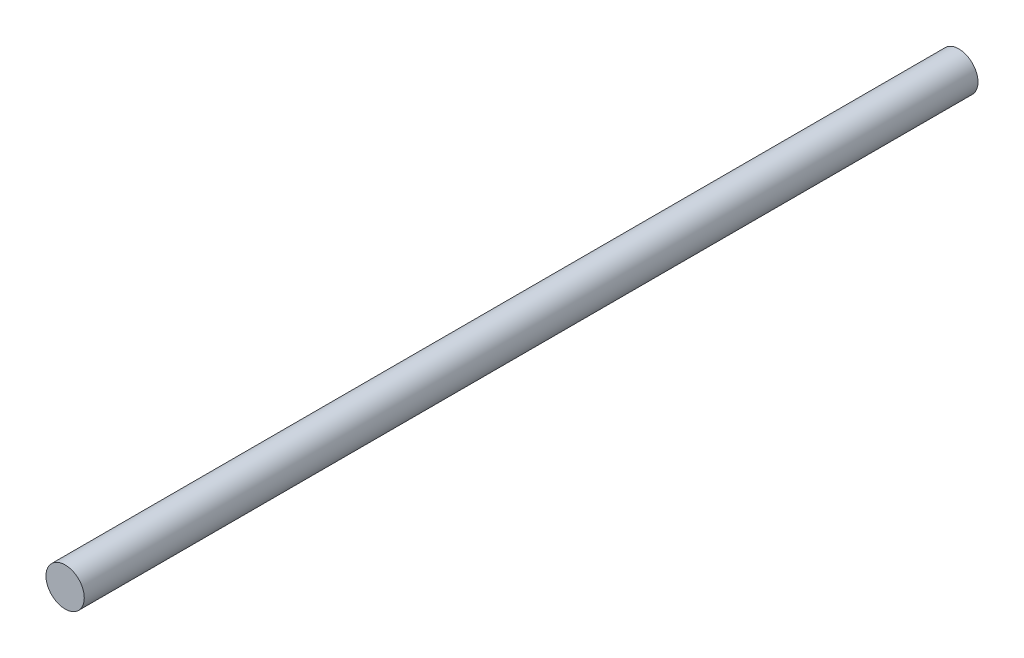
ISO-10303-21;
HEADER;
FILE_DESCRIPTION(('STEP AP214'),'2;1');
FILE_NAME('part.step','',(''),(''),'','','');
FILE_SCHEMA(('AUTOMOTIVE_DESIGN { 1 0 10303 214 1 1 1 1 }'));
ENDSEC;
DATA;
#1=APPLICATION_CONTEXT('core data for automotive mechanical design processes');
#2=APPLICATION_PROTOCOL_DEFINITION('international standard','automotive_design',2000,#1);
#3=PRODUCT_CONTEXT('',#1,'mechanical');
#4=PRODUCT('Part','Part','',(#3));
#5=PRODUCT_RELATED_PRODUCT_CATEGORY('part','',(#4));
#6=PRODUCT_DEFINITION_FORMATION('','',#4);
#7=PRODUCT_DEFINITION_CONTEXT('part definition',#1,'design');
#8=PRODUCT_DEFINITION('design','',#6,#7);
#9=PRODUCT_DEFINITION_SHAPE('','',#8);
#10=(LENGTH_UNIT() NAMED_UNIT(*) SI_UNIT(.MILLI.,.METRE.));
#11=(NAMED_UNIT(*) PLANE_ANGLE_UNIT() SI_UNIT($,.RADIAN.));
#12=(NAMED_UNIT(*) SI_UNIT($,.STERADIAN.) SOLID_ANGLE_UNIT());
#13=UNCERTAINTY_MEASURE_WITH_UNIT(LENGTH_MEASURE(1.E-05),#10,'distance_accuracy_value','');
#14=(GEOMETRIC_REPRESENTATION_CONTEXT(3) GLOBAL_UNCERTAINTY_ASSIGNED_CONTEXT((#13)) GLOBAL_UNIT_ASSIGNED_CONTEXT((#10,
#11,#12)) REPRESENTATION_CONTEXT('',''));
#15=CARTESIAN_POINT('',(0.,0.,0.));
#16=DIRECTION('',(0.,0.,1.));
#17=DIRECTION('',(1.,0.,0.));
#18=AXIS2_PLACEMENT_3D('',#15,#16,#17);
#19=CARTESIAN_POINT('',(0.,0.,70.));
#20=DIRECTION('',(0.,0.,-1.));
#21=DIRECTION('',(-1.,0.,0.));
#22=AXIS2_PLACEMENT_3D('',#19,#20,#21);
#23=CYLINDRICAL_SURFACE('',#22,1.5);
#24=CARTESIAN_POINT('',(0.,0.,70.));
#25=DIRECTION('',(0.,0.,1.));
#26=DIRECTION('',(1.,0.,0.));
#27=AXIS2_PLACEMENT_3D('',#24,#25,#26);
#28=CIRCLE('',#27,1.5);
#29=CARTESIAN_POINT('',(1.5,0.,70.));
#30=VERTEX_POINT('',#29);
#31=EDGE_CURVE('E10',#30,#30,#28,.T.);
#32=ORIENTED_EDGE('',*,*,#31,.F.);
#33=EDGE_LOOP('',(#32));
#34=FACE_BOUND('',#33,.T.);
#35=CARTESIAN_POINT('',(0.,0.,0.));
#36=DIRECTION('',(0.,0.,1.));
#37=DIRECTION('',(1.,0.,0.));
#38=AXIS2_PLACEMENT_3D('',#35,#36,#37);
#39=CIRCLE('',#38,1.5);
#40=CARTESIAN_POINT('',(1.5,0.,0.));
#41=VERTEX_POINT('',#40);
#42=EDGE_CURVE('E42',#41,#41,#39,.T.);
#43=ORIENTED_EDGE('',*,*,#42,.T.);
#44=EDGE_LOOP('',(#43));
#45=FACE_BOUND('',#44,.T.);
#46=ADVANCED_FACE('F39',(#34,#45),#23,.T.);
#47=CARTESIAN_POINT('',(0.,0.,70.));
#48=DIRECTION('',(0.,0.,1.));
#49=DIRECTION('',(1.,0.,0.));
#50=AXIS2_PLACEMENT_3D('',#47,#48,#49);
#51=PLANE('',#50);
#52=ORIENTED_EDGE('',*,*,#31,.T.);
#53=EDGE_LOOP('',(#52));
#54=FACE_BOUND('',#53,.T.);
#55=ADVANCED_FACE('F54',(#54),#51,.T.);
#56=CARTESIAN_POINT('',(0.,0.,0.));
#57=DIRECTION('',(0.,0.,1.));
#58=DIRECTION('',(1.,0.,0.));
#59=AXIS2_PLACEMENT_3D('',#56,#57,#58);
#60=PLANE('',#59);
#61=ORIENTED_EDGE('',*,*,#42,.F.);
#62=EDGE_LOOP('',(#61));
#63=FACE_BOUND('',#62,.T.);
#64=ADVANCED_FACE('F52',(#63),#60,.F.);
#65=CLOSED_SHELL('',(#46,#55,#64));
#66=MANIFOLD_SOLID_BREP('B2',#65);
#67=ADVANCED_BREP_SHAPE_REPRESENTATION('',(#18,#66),#14);
#68=SHAPE_DEFINITION_REPRESENTATION(#9,#67);
ENDSEC;
END-ISO-10303-21;
